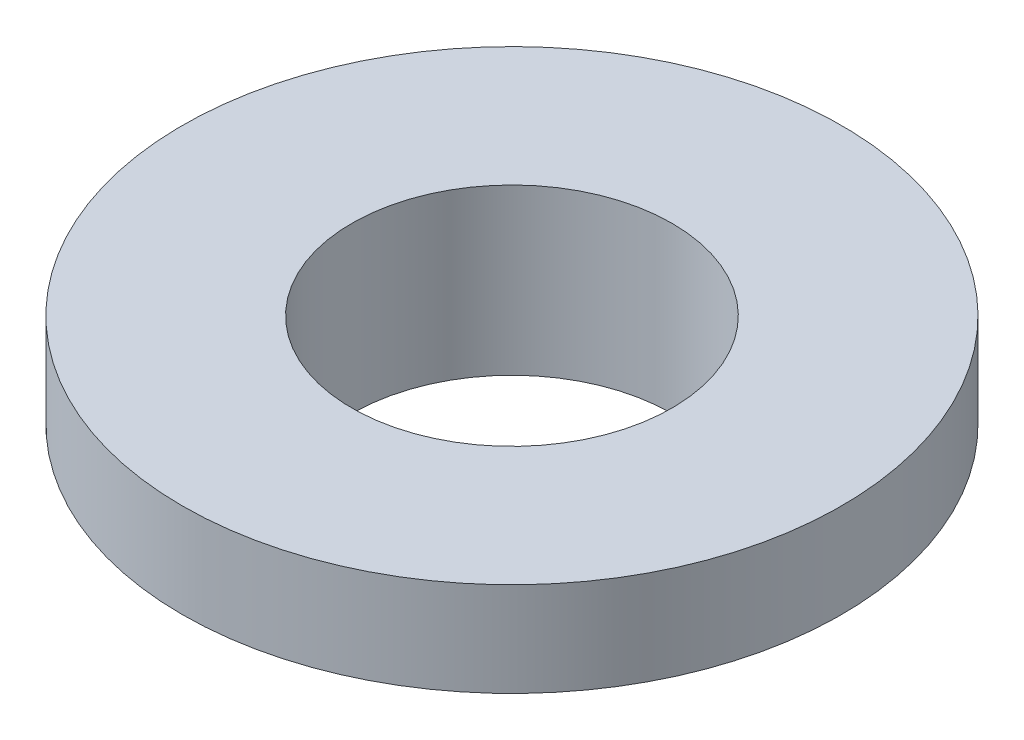
ISO-10303-21;
HEADER;
FILE_DESCRIPTION(('STEP AP214'),'2;1');
FILE_NAME('part.step','',(''),(''),'','','');
FILE_SCHEMA(('AUTOMOTIVE_DESIGN { 1 0 10303 214 1 1 1 1 }'));
ENDSEC;
DATA;
#1=APPLICATION_CONTEXT('core data for automotive mechanical design processes');
#2=APPLICATION_PROTOCOL_DEFINITION('international standard','automotive_design',2000,#1);
#3=PRODUCT_CONTEXT('',#1,'mechanical');
#4=PRODUCT('Part','Part','',(#3));
#5=PRODUCT_RELATED_PRODUCT_CATEGORY('part','',(#4));
#6=PRODUCT_DEFINITION_FORMATION('','',#4);
#7=PRODUCT_DEFINITION_CONTEXT('part definition',#1,'design');
#8=PRODUCT_DEFINITION('design','',#6,#7);
#9=PRODUCT_DEFINITION_SHAPE('','',#8);
#10=(LENGTH_UNIT() NAMED_UNIT(*) SI_UNIT(.MILLI.,.METRE.));
#11=(NAMED_UNIT(*) PLANE_ANGLE_UNIT() SI_UNIT($,.RADIAN.));
#12=(NAMED_UNIT(*) SI_UNIT($,.STERADIAN.) SOLID_ANGLE_UNIT());
#13=UNCERTAINTY_MEASURE_WITH_UNIT(LENGTH_MEASURE(1.E-05),#10,'distance_accuracy_value','');
#14=(GEOMETRIC_REPRESENTATION_CONTEXT(3) GLOBAL_UNCERTAINTY_ASSIGNED_CONTEXT((#13)) GLOBAL_UNIT_ASSIGNED_CONTEXT((#10,
#11,#12)) REPRESENTATION_CONTEXT('',''));
#15=CARTESIAN_POINT('',(0.,0.,0.));
#16=DIRECTION('',(0.,0.,1.));
#17=DIRECTION('',(1.,0.,0.));
#18=AXIS2_PLACEMENT_3D('',#15,#16,#17);
#19=CARTESIAN_POINT('',(0.,0.,0.));
#20=DIRECTION('',(0.,1.,0.));
#21=DIRECTION('',(0.,0.,1.));
#22=AXIS2_PLACEMENT_3D('',#19,#20,#21);
#23=PLANE('',#22);
#24=CARTESIAN_POINT('',(0.,0.,0.));
#25=DIRECTION('',(0.,1.,0.));
#26=DIRECTION('',(0.,0.,1.));
#27=AXIS2_PLACEMENT_3D('',#24,#25,#26);
#28=CIRCLE('',#27,5.715);
#29=CARTESIAN_POINT('',(0.,0.,-5.715));
#30=VERTEX_POINT('',#29);
#31=EDGE_CURVE('E39',#30,#30,#28,.T.);
#32=ORIENTED_EDGE('',*,*,#31,.F.);
#33=EDGE_LOOP('',(#32));
#34=FACE_BOUND('',#33,.T.);
#35=CARTESIAN_POINT('',(0.,0.,0.));
#36=DIRECTION('',(0.,1.,0.));
#37=DIRECTION('',(0.,0.,1.));
#38=AXIS2_PLACEMENT_3D('',#35,#36,#37);
#39=CIRCLE('',#38,4.318);
#40=CARTESIAN_POINT('',(0.,0.,-4.318));
#41=VERTEX_POINT('',#40);
#42=EDGE_CURVE('E46',#41,#41,#39,.T.);
#43=ORIENTED_EDGE('',*,*,#42,.T.);
#44=EDGE_LOOP('',(#43));
#45=FACE_BOUND('',#44,.T.);
#46=ADVANCED_FACE('F35',(#34,#45),#23,.F.);
#47=CARTESIAN_POINT('',(0.,1.905,0.));
#48=DIRECTION('',(0.,-1.,0.));
#49=DIRECTION('',(0.,0.,-1.));
#50=AXIS2_PLACEMENT_3D('',#47,#48,#49);
#51=CYLINDRICAL_SURFACE('',#50,5.715);
#52=CARTESIAN_POINT('',(0.,1.905,0.));
#53=DIRECTION('',(0.,1.,0.));
#54=DIRECTION('',(0.,0.,1.));
#55=AXIS2_PLACEMENT_3D('',#52,#53,#54);
#56=CIRCLE('',#55,5.715);
#57=CARTESIAN_POINT('',(0.,1.905,-5.715));
#58=VERTEX_POINT('',#57);
#59=EDGE_CURVE('E10',#58,#58,#56,.T.);
#60=CARTESIAN_POINT('',(0.,1.905,-5.715));
#61=CARTESIAN_POINT('',(0.,1.88515625,-5.715));
#62=CARTESIAN_POINT('',(0.,1.8653125,-5.715));
#63=CARTESIAN_POINT('',(0.,1.825625,-5.715));
#64=CARTESIAN_POINT('',(0.,1.80578125,-5.715));
#65=CARTESIAN_POINT('',(0.,1.76609375,-5.715));
#66=CARTESIAN_POINT('',(0.,1.74625,-5.715));
#67=CARTESIAN_POINT('',(0.,1.7065625,-5.715));
#68=CARTESIAN_POINT('',(0.,1.68671875,-5.715));
#69=CARTESIAN_POINT('',(0.,1.64703125,-5.715));
#70=CARTESIAN_POINT('',(0.,1.6271875,-5.715));
#71=CARTESIAN_POINT('',(0.,1.5875,-5.715));
#72=CARTESIAN_POINT('',(0.,1.56765625,-5.715));
#73=CARTESIAN_POINT('',(0.,1.52796875,-5.715));
#74=CARTESIAN_POINT('',(0.,1.508125,-5.715));
#75=CARTESIAN_POINT('',(0.,1.4684375,-5.715));
#76=CARTESIAN_POINT('',(0.,1.44859375,-5.715));
#77=CARTESIAN_POINT('',(0.,1.40890625,-5.715));
#78=CARTESIAN_POINT('',(0.,1.3890625,-5.715));
#79=CARTESIAN_POINT('',(0.,1.349375,-5.715));
#80=CARTESIAN_POINT('',(0.,1.32953125,-5.715));
#81=CARTESIAN_POINT('',(0.,1.28984375,-5.715));
#82=CARTESIAN_POINT('',(0.,1.27,-5.715));
#83=CARTESIAN_POINT('',(0.,1.2303125,-5.715));
#84=CARTESIAN_POINT('',(0.,1.21046875,-5.715));
#85=CARTESIAN_POINT('',(0.,1.17078125,-5.715));
#86=CARTESIAN_POINT('',(0.,1.1509375,-5.715));
#87=CARTESIAN_POINT('',(0.,1.11125,-5.715));
#88=CARTESIAN_POINT('',(0.,1.09140625,-5.715));
#89=CARTESIAN_POINT('',(0.,1.05171875,-5.715));
#90=CARTESIAN_POINT('',(0.,1.031875,-5.715));
#91=CARTESIAN_POINT('',(0.,0.9921875,-5.715));
#92=CARTESIAN_POINT('',(0.,0.97234375,-5.715));
#93=CARTESIAN_POINT('',(0.,0.93265625,-5.715));
#94=CARTESIAN_POINT('',(0.,0.9128125,-5.715));
#95=CARTESIAN_POINT('',(0.,0.873125,-5.715));
#96=CARTESIAN_POINT('',(0.,0.85328125,-5.715));
#97=CARTESIAN_POINT('',(0.,0.81359375,-5.715));
#98=CARTESIAN_POINT('',(0.,0.79375,-5.715));
#99=CARTESIAN_POINT('',(0.,0.7540625,-5.715));
#100=CARTESIAN_POINT('',(0.,0.73421875,-5.715));
#101=CARTESIAN_POINT('',(0.,0.69453125,-5.715));
#102=CARTESIAN_POINT('',(0.,0.6746875,-5.715));
#103=CARTESIAN_POINT('',(0.,0.635,-5.715));
#104=CARTESIAN_POINT('',(0.,0.61515625,-5.715));
#105=CARTESIAN_POINT('',(0.,0.57546875,-5.715));
#106=CARTESIAN_POINT('',(0.,0.555625,-5.715));
#107=CARTESIAN_POINT('',(0.,0.5159375,-5.715));
#108=CARTESIAN_POINT('',(0.,0.49609375,-5.715));
#109=CARTESIAN_POINT('',(0.,0.45640625,-5.715));
#110=CARTESIAN_POINT('',(0.,0.4365625,-5.715));
#111=CARTESIAN_POINT('',(0.,0.396875,-5.715));
#112=CARTESIAN_POINT('',(0.,0.37703125,-5.715));
#113=CARTESIAN_POINT('',(0.,0.33734375,-5.715));
#114=CARTESIAN_POINT('',(0.,0.3175,-5.715));
#115=CARTESIAN_POINT('',(0.,0.2778125,-5.715));
#116=CARTESIAN_POINT('',(0.,0.25796875,-5.715));
#117=CARTESIAN_POINT('',(0.,0.21828125,-5.715));
#118=CARTESIAN_POINT('',(0.,0.1984375,-5.715));
#119=CARTESIAN_POINT('',(0.,0.15875,-5.715));
#120=CARTESIAN_POINT('',(0.,0.13890625,-5.715));
#121=CARTESIAN_POINT('',(0.,0.09921875,-5.715));
#122=CARTESIAN_POINT('',(0.,0.0793749999999999,-5.715));
#123=CARTESIAN_POINT('',(0.,0.0396874999999999,-5.715));
#124=CARTESIAN_POINT('',(0.,0.01984375,-5.715));
#125=CARTESIAN_POINT('',(0.,0.,-5.715));
#126=B_SPLINE_CURVE_WITH_KNOTS('',3,(#60,#61,#62,#63,#64,#65,#66,#67,#68,#69,#70,#71,#72,#73,
#74,#75,#76,#77,#78,#79,#80,#81,#82,#83,#84,#85,#86,#87,#88,#89,#90,#91,#92,#93,#94,#95,#96,#97,
#98,#99,#100,#101,#102,#103,#104,#105,#106,#107,#108,#109,#110,#111,#112,#113,#114,#115,#116,
#117,#118,#119,#120,#121,#122,#123,#124,#125),.UNSPECIFIED.,.F.,.F.,(4,2,2,2,2,2,2,2,2,2,2,2,2,
2,2,2,2,2,2,2,2,2,2,2,2,2,2,2,2,2,2,2,4),(0.,0.0595312499999999,0.1190625,0.17859375,0.238125,
0.29765625,0.3571875,0.41671875,0.47625,0.53578125,0.5953125,0.65484375,0.714375,0.77390625,
0.833437499999999,0.89296875,0.9525,1.01203125,1.0715625,1.13109375,1.190625,1.25015625,
1.3096875,1.36921875,1.42875,1.48828125,1.5478125,1.60734375,1.666875,1.72640625,1.7859375,
1.84546875,1.905),.UNSPECIFIED.);
#127=EDGE_CURVE('BSEAM37',#58,#30,#126,.T.);
#128=ORIENTED_EDGE('',*,*,#59,.F.);
#129=ORIENTED_EDGE('',*,*,#31,.T.);
#130=ORIENTED_EDGE('',*,*,#127,.T.);
#131=ORIENTED_EDGE('',*,*,#127,.F.);
#132=EDGE_LOOP('',(#128,#130,#129,#131));
#133=FACE_BOUND('',#132,.T.);
#134=ADVANCED_FACE('F37',(#133),#51,.T.);
#135=CARTESIAN_POINT('',(0.,1.905,0.));
#136=DIRECTION('',(0.,-1.,0.));
#137=DIRECTION('',(0.,0.,-1.));
#138=AXIS2_PLACEMENT_3D('',#135,#136,#137);
#139=CYLINDRICAL_SURFACE('',#138,4.318);
#140=CARTESIAN_POINT('',(0.,4.445,0.));
#141=DIRECTION('',(0.,1.,0.));
#142=DIRECTION('',(0.,0.,1.));
#143=AXIS2_PLACEMENT_3D('',#140,#141,#142);
#144=CIRCLE('',#143,4.318);
#145=CARTESIAN_POINT('',(0.,4.445,-4.318));
#146=VERTEX_POINT('',#145);
#147=EDGE_CURVE('E54',#146,#146,#144,.T.);
#148=CARTESIAN_POINT('',(0.,0.,-4.318));
#149=CARTESIAN_POINT('',(0.,0.0463020833333333,-4.318));
#150=CARTESIAN_POINT('',(0.,0.0926041666666667,-4.318));
#151=CARTESIAN_POINT('',(0.,0.185208333333333,-4.318));
#152=CARTESIAN_POINT('',(0.,0.231510416666667,-4.318));
#153=CARTESIAN_POINT('',(0.,0.324114583333333,-4.318));
#154=CARTESIAN_POINT('',(0.,0.370416666666667,-4.318));
#155=CARTESIAN_POINT('',(0.,0.463020833333333,-4.318));
#156=CARTESIAN_POINT('',(0.,0.509322916666667,-4.318));
#157=CARTESIAN_POINT('',(0.,0.601927083333334,-4.318));
#158=CARTESIAN_POINT('',(0.,0.648229166666667,-4.318));
#159=CARTESIAN_POINT('',(0.,0.740833333333334,-4.318));
#160=CARTESIAN_POINT('',(0.,0.787135416666667,-4.318));
#161=CARTESIAN_POINT('',(0.,0.879739583333333,-4.318));
#162=CARTESIAN_POINT('',(0.,0.926041666666667,-4.318));
#163=CARTESIAN_POINT('',(0.,1.01864583333333,-4.318));
#164=CARTESIAN_POINT('',(0.,1.06494791666667,-4.318));
#165=CARTESIAN_POINT('',(0.,1.15755208333333,-4.318));
#166=CARTESIAN_POINT('',(0.,1.20385416666667,-4.318));
#167=CARTESIAN_POINT('',(0.,1.29645833333333,-4.318));
#168=CARTESIAN_POINT('',(0.,1.34276041666667,-4.318));
#169=CARTESIAN_POINT('',(0.,1.43536458333333,-4.318));
#170=CARTESIAN_POINT('',(0.,1.48166666666667,-4.318));
#171=CARTESIAN_POINT('',(0.,1.57427083333333,-4.318));
#172=CARTESIAN_POINT('',(0.,1.62057291666667,-4.318));
#173=CARTESIAN_POINT('',(0.,1.71317708333333,-4.318));
#174=CARTESIAN_POINT('',(0.,1.75947916666667,-4.318));
#175=CARTESIAN_POINT('',(0.,1.85208333333333,-4.318));
#176=CARTESIAN_POINT('',(0.,1.89838541666667,-4.318));
#177=CARTESIAN_POINT('',(0.,1.99098958333333,-4.318));
#178=CARTESIAN_POINT('',(0.,2.03729166666667,-4.318));
#179=CARTESIAN_POINT('',(0.,2.12989583333333,-4.318));
#180=CARTESIAN_POINT('',(0.,2.17619791666667,-4.318));
#181=CARTESIAN_POINT('',(0.,2.26880208333333,-4.318));
#182=CARTESIAN_POINT('',(0.,2.31510416666667,-4.318));
#183=CARTESIAN_POINT('',(0.,2.40770833333333,-4.318));
#184=CARTESIAN_POINT('',(0.,2.45401041666667,-4.318));
#185=CARTESIAN_POINT('',(0.,2.54661458333333,-4.318));
#186=CARTESIAN_POINT('',(0.,2.59291666666667,-4.318));
#187=CARTESIAN_POINT('',(0.,2.68552083333333,-4.318));
#188=CARTESIAN_POINT('',(0.,2.73182291666667,-4.318));
#189=CARTESIAN_POINT('',(0.,2.82442708333333,-4.318));
#190=CARTESIAN_POINT('',(0.,2.87072916666667,-4.318));
#191=CARTESIAN_POINT('',(0.,2.96333333333333,-4.318));
#192=CARTESIAN_POINT('',(0.,3.00963541666667,-4.318));
#193=CARTESIAN_POINT('',(0.,3.10223958333333,-4.318));
#194=CARTESIAN_POINT('',(0.,3.14854166666667,-4.318));
#195=CARTESIAN_POINT('',(0.,3.24114583333333,-4.318));
#196=CARTESIAN_POINT('',(0.,3.28744791666667,-4.318));
#197=CARTESIAN_POINT('',(0.,3.38005208333333,-4.318));
#198=CARTESIAN_POINT('',(0.,3.42635416666667,-4.318));
#199=CARTESIAN_POINT('',(0.,3.51895833333333,-4.318));
#200=CARTESIAN_POINT('',(0.,3.56526041666667,-4.318));
#201=CARTESIAN_POINT('',(0.,3.65786458333333,-4.318));
#202=CARTESIAN_POINT('',(0.,3.70416666666667,-4.318));
#203=CARTESIAN_POINT('',(0.,3.79677083333333,-4.318));
#204=CARTESIAN_POINT('',(0.,3.84307291666667,-4.318));
#205=CARTESIAN_POINT('',(0.,3.93567708333333,-4.318));
#206=CARTESIAN_POINT('',(0.,3.98197916666667,-4.318));
#207=CARTESIAN_POINT('',(0.,4.07458333333333,-4.318));
#208=CARTESIAN_POINT('',(0.,4.12088541666667,-4.318));
#209=CARTESIAN_POINT('',(0.,4.21348958333333,-4.318));
#210=CARTESIAN_POINT('',(0.,4.25979166666667,-4.318));
#211=CARTESIAN_POINT('',(0.,4.35239583333333,-4.318));
#212=CARTESIAN_POINT('',(0.,4.39869791666667,-4.318));
#213=CARTESIAN_POINT('',(0.,4.445,-4.318));
#214=B_SPLINE_CURVE_WITH_KNOTS('',3,(#148,#149,#150,#151,#152,#153,#154,#155,#156,#157,#158,
#159,#160,#161,#162,#163,#164,#165,#166,#167,#168,#169,#170,#171,#172,#173,#174,#175,#176,#177,
#178,#179,#180,#181,#182,#183,#184,#185,#186,#187,#188,#189,#190,#191,#192,#193,#194,#195,#196,
#197,#198,#199,#200,#201,#202,#203,#204,#205,#206,#207,#208,#209,#210,#211,#212,#213),
.UNSPECIFIED.,.F.,.F.,(4,2,2,2,2,2,2,2,2,2,2,2,2,2,2,2,2,2,2,2,2,2,2,2,2,2,2,2,2,2,2,2,4),(0.,
0.13890625,0.2778125,0.41671875,0.555625,0.69453125,0.8334375,0.97234375,1.11125,1.25015625,
1.3890625,1.52796875,1.666875,1.80578125,1.9446875,2.08359375,2.2225,2.36140625,2.5003125,
2.63921875,2.778125,2.91703125,3.0559375,3.19484375,3.33375,3.47265625,3.6115625,3.75046875,
3.889375,4.02828125,4.1671875,4.30609375,4.445),.UNSPECIFIED.);
#215=EDGE_CURVE('BSEAM60',#41,#146,#214,.T.);
#216=ORIENTED_EDGE('',*,*,#42,.F.);
#217=ORIENTED_EDGE('',*,*,#147,.T.);
#218=ORIENTED_EDGE('',*,*,#215,.T.);
#219=ORIENTED_EDGE('',*,*,#215,.F.);
#220=EDGE_LOOP('',(#216,#218,#217,#219));
#221=FACE_BOUND('',#220,.T.);
#222=ADVANCED_FACE('F60',(#221),#139,.F.);
#223=CARTESIAN_POINT('',(0.,4.445,0.));
#224=DIRECTION('',(0.,1.,0.));
#225=DIRECTION('',(0.,0.,1.));
#226=AXIS2_PLACEMENT_3D('',#223,#224,#225);
#227=PLANE('',#226);
#228=CARTESIAN_POINT('',(0.,4.445,0.));
#229=DIRECTION('',(0.,1.,0.));
#230=DIRECTION('',(0.,0.,1.));
#231=AXIS2_PLACEMENT_3D('',#228,#229,#230);
#232=CIRCLE('',#231,8.89);
#233=CARTESIAN_POINT('',(0.,4.445,8.89));
#234=VERTEX_POINT('',#233);
#235=EDGE_CURVE('E50',#234,#234,#232,.T.);
#236=ORIENTED_EDGE('',*,*,#235,.T.);
#237=EDGE_LOOP('',(#236));
#238=FACE_BOUND('',#237,.T.);
#239=ORIENTED_EDGE('',*,*,#147,.F.);
#240=EDGE_LOOP('',(#239));
#241=FACE_BOUND('',#240,.T.);
#242=ADVANCED_FACE('F62',(#238,#241),#227,.T.);
#243=CARTESIAN_POINT('',(0.,1.905,0.));
#244=DIRECTION('',(0.,1.,0.));
#245=DIRECTION('',(0.,0.,1.));
#246=AXIS2_PLACEMENT_3D('',#243,#244,#245);
#247=PLANE('',#246);
#248=ORIENTED_EDGE('',*,*,#59,.T.);
#249=EDGE_LOOP('',(#248));
#250=FACE_BOUND('',#249,.T.);
#251=CARTESIAN_POINT('',(0.,1.905,0.));
#252=DIRECTION('',(0.,1.,0.));
#253=DIRECTION('',(0.,0.,1.));
#254=AXIS2_PLACEMENT_3D('',#251,#252,#253);
#255=CIRCLE('',#254,8.89);
#256=CARTESIAN_POINT('',(0.,1.905,8.89));
#257=VERTEX_POINT('',#256);
#258=EDGE_CURVE('E51',#257,#257,#255,.T.);
#259=ORIENTED_EDGE('',*,*,#258,.F.);
#260=EDGE_LOOP('',(#259));
#261=FACE_BOUND('',#260,.T.);
#262=ADVANCED_FACE('F64',(#250,#261),#247,.F.);
#263=CARTESIAN_POINT('',(0.,4.445,0.));
#264=DIRECTION('',(0.,-1.,0.));
#265=DIRECTION('',(0.,0.,-1.));
#266=AXIS2_PLACEMENT_3D('',#263,#264,#265);
#267=CYLINDRICAL_SURFACE('',#266,8.89);
#268=ORIENTED_EDGE('',*,*,#235,.F.);
#269=EDGE_LOOP('',(#268));
#270=FACE_BOUND('',#269,.T.);
#271=ORIENTED_EDGE('',*,*,#258,.T.);
#272=EDGE_LOOP('',(#271));
#273=FACE_BOUND('',#272,.T.);
#274=ADVANCED_FACE('F71',(#270,#273),#267,.T.);
#275=CLOSED_SHELL('',(#46,#134,#222,#242,#262,#274));
#276=MANIFOLD_SOLID_BREP('B2',#275);
#277=ADVANCED_BREP_SHAPE_REPRESENTATION('',(#18,#276),#14);
#278=SHAPE_DEFINITION_REPRESENTATION(#9,#277);
ENDSEC;
END-ISO-10303-21;
